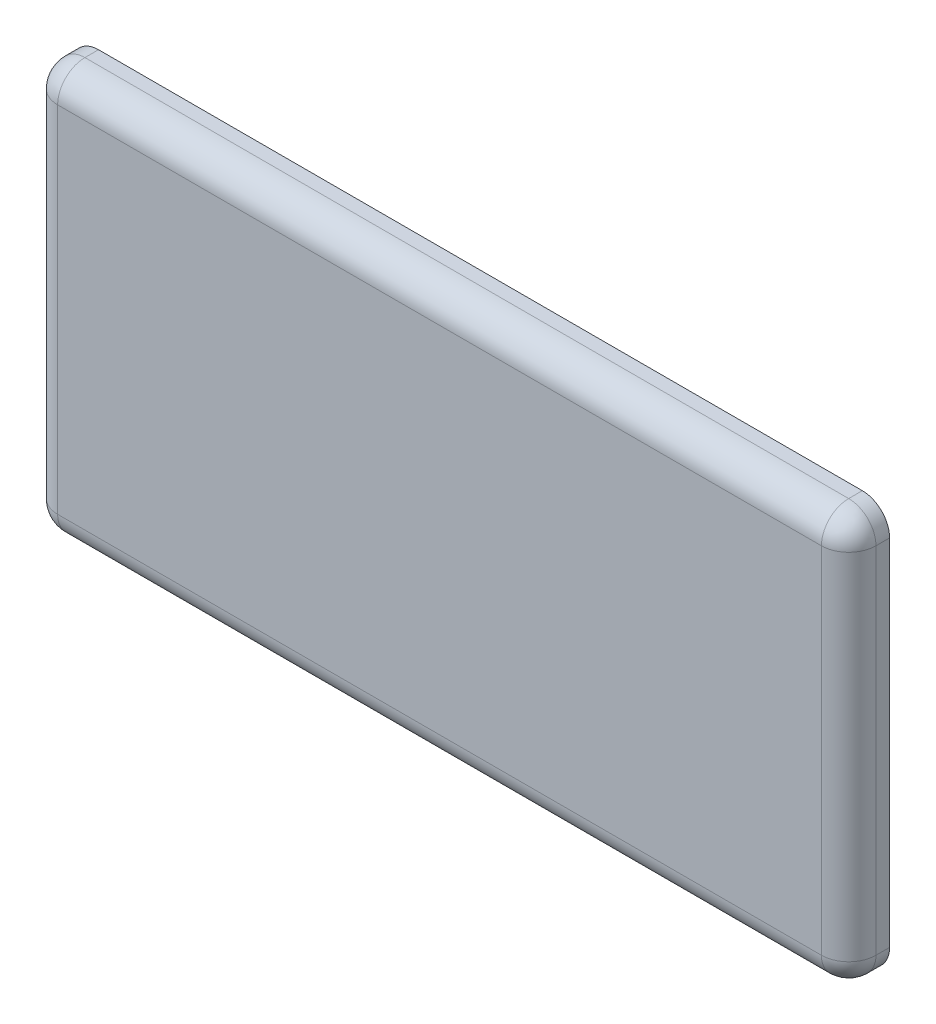
ISO-10303-21;
HEADER;
FILE_DESCRIPTION(('STEP AP214'),'2;1');
FILE_NAME('part.step','',(''),(''),'','','');
FILE_SCHEMA(('AUTOMOTIVE_DESIGN { 1 0 10303 214 1 1 1 1 }'));
ENDSEC;
DATA;
#1=APPLICATION_CONTEXT('core data for automotive mechanical design processes');
#2=APPLICATION_PROTOCOL_DEFINITION('international standard','automotive_design',2000,#1);
#3=PRODUCT_CONTEXT('',#1,'mechanical');
#4=PRODUCT('Part','Part','',(#3));
#5=PRODUCT_RELATED_PRODUCT_CATEGORY('part','',(#4));
#6=PRODUCT_DEFINITION_FORMATION('','',#4);
#7=PRODUCT_DEFINITION_CONTEXT('part definition',#1,'design');
#8=PRODUCT_DEFINITION('design','',#6,#7);
#9=PRODUCT_DEFINITION_SHAPE('','',#8);
#10=(LENGTH_UNIT() NAMED_UNIT(*) SI_UNIT(.MILLI.,.METRE.));
#11=(NAMED_UNIT(*) PLANE_ANGLE_UNIT() SI_UNIT($,.RADIAN.));
#12=(NAMED_UNIT(*) SI_UNIT($,.STERADIAN.) SOLID_ANGLE_UNIT());
#13=UNCERTAINTY_MEASURE_WITH_UNIT(LENGTH_MEASURE(1.E-05),#10,'distance_accuracy_value','');
#14=(GEOMETRIC_REPRESENTATION_CONTEXT(3) GLOBAL_UNCERTAINTY_ASSIGNED_CONTEXT((#13)) GLOBAL_UNIT_ASSIGNED_CONTEXT((#10,
#11,#12)) REPRESENTATION_CONTEXT('',''));
#15=CARTESIAN_POINT('',(0.,0.,0.));
#16=DIRECTION('',(0.,0.,1.));
#17=DIRECTION('',(1.,0.,0.));
#18=AXIS2_PLACEMENT_3D('',#15,#16,#17);
#19=CARTESIAN_POINT('',(30.,15.,3.));
#20=DIRECTION('',(0.,0.,1.));
#21=DIRECTION('',(1.,0.,0.));
#22=AXIS2_PLACEMENT_3D('',#19,#20,#21);
#23=PLANE('',#22);
#24=DIRECTION('',(1.,0.,0.));
#25=VECTOR('',#24,1.);
#26=CARTESIAN_POINT('',(0.,28.,3.));
#27=LINE('',#26,#25);
#28=CARTESIAN_POINT('',(58.,28.,3.));
#29=VERTEX_POINT('',#28);
#30=CARTESIAN_POINT('',(2.,28.,3.));
#31=VERTEX_POINT('',#30);
#32=EDGE_CURVE('E182',#29,#31,#27,.F.);
#33=ORIENTED_EDGE('',*,*,#32,.T.);
#34=DIRECTION('',(0.,1.,0.));
#35=VECTOR('',#34,1.);
#36=CARTESIAN_POINT('',(2.,0.,3.));
#37=LINE('',#36,#35);
#38=CARTESIAN_POINT('',(2.,2.,3.));
#39=VERTEX_POINT('',#38);
#40=EDGE_CURVE('E177',#31,#39,#37,.F.);
#41=ORIENTED_EDGE('',*,*,#40,.T.);
#42=DIRECTION('',(1.,0.,0.));
#43=VECTOR('',#42,1.);
#44=CARTESIAN_POINT('',(0.,2.,3.));
#45=LINE('',#44,#43);
#46=CARTESIAN_POINT('',(58.,2.,3.));
#47=VERTEX_POINT('',#46);
#48=EDGE_CURVE('E171',#39,#47,#45,.T.);
#49=ORIENTED_EDGE('',*,*,#48,.T.);
#50=DIRECTION('',(0.,1.,0.));
#51=VECTOR('',#50,1.);
#52=CARTESIAN_POINT('',(58.,0.,3.));
#53=LINE('',#52,#51);
#54=EDGE_CURVE('E121',#47,#29,#53,.T.);
#55=ORIENTED_EDGE('',*,*,#54,.T.);
#56=EDGE_LOOP('',(#33,#41,#49,#55));
#57=FACE_BOUND('',#56,.T.);
#58=ADVANCED_FACE('F16',(#57),#23,.T.);
#59=CARTESIAN_POINT('',(58.,2.,1.));
#60=DIRECTION('',(0.,1.,0.));
#61=DIRECTION('',(0.,0.,1.));
#62=AXIS2_PLACEMENT_3D('',#59,#60,#61);
#63=CYLINDRICAL_SURFACE('',#62,2.);
#64=DIRECTION('',(0.,1.,0.));
#65=VECTOR('',#64,1.);
#66=CARTESIAN_POINT('',(60.,15.,1.));
#67=LINE('',#66,#65);
#68=CARTESIAN_POINT('',(60.,2.,1.));
#69=VERTEX_POINT('',#68);
#70=CARTESIAN_POINT('',(60.,28.,1.));
#71=VERTEX_POINT('',#70);
#72=EDGE_CURVE('E123',#69,#71,#67,.T.);
#73=ORIENTED_EDGE('',*,*,#72,.T.);
#74=CARTESIAN_POINT('',(58.,28.,1.));
#75=DIRECTION('',(0.,1.,0.));
#76=DIRECTION('',(0.,0.,1.));
#77=AXIS2_PLACEMENT_3D('',#74,#75,#76);
#78=CIRCLE('',#77,2.);
#79=EDGE_CURVE('E20',#71,#29,#78,.F.);
#80=ORIENTED_EDGE('',*,*,#79,.T.);
#81=ORIENTED_EDGE('',*,*,#54,.F.);
#82=CARTESIAN_POINT('',(58.,2.,1.));
#83=DIRECTION('',(0.,1.,0.));
#84=DIRECTION('',(0.,0.,1.));
#85=AXIS2_PLACEMENT_3D('',#82,#83,#84);
#86=CIRCLE('',#85,2.);
#87=EDGE_CURVE('E126',#47,#69,#86,.T.);
#88=ORIENTED_EDGE('',*,*,#87,.T.);
#89=EDGE_LOOP('',(#73,#80,#81,#88));
#90=FACE_BOUND('',#89,.T.);
#91=ADVANCED_FACE('F124',(#90),#63,.T.);
#92=CARTESIAN_POINT('',(58.,28.,1.));
#93=DIRECTION('',(0.95671349487769,0.288115103977403,0.0410971480641482));
#94=DIRECTION('',(-0.271041494718296,0.830639764340859,0.486388825978388));
#95=AXIS2_PLACEMENT_3D('',#92,#93,#94);
#96=SPHERICAL_SURFACE('',#95,2.);
#97=CARTESIAN_POINT('',(59.9134269897554,28.5762302079548,1.08219429612829));
#98=VERTEX_POINT('',#97);
#99=VERTEX_LOOP('',#98);
#100=FACE_BOUND('',#99,.T.);
#101=ORIENTED_EDGE('',*,*,#79,.F.);
#102=CARTESIAN_POINT('',(58.,28.,1.));
#103=DIRECTION('',(0.,0.,1.));
#104=DIRECTION('',(1.,0.,0.));
#105=AXIS2_PLACEMENT_3D('',#102,#103,#104);
#106=CIRCLE('',#105,2.);
#107=CARTESIAN_POINT('',(58.,30.,1.));
#108=VERTEX_POINT('',#107);
#109=EDGE_CURVE('E115',#71,#108,#106,.T.);
#110=ORIENTED_EDGE('',*,*,#109,.T.);
#111=CARTESIAN_POINT('',(58.,28.,1.));
#112=DIRECTION('',(1.,0.,0.));
#113=DIRECTION('',(0.,0.,-1.));
#114=AXIS2_PLACEMENT_3D('',#111,#112,#113);
#115=CIRCLE('',#114,2.);
#116=EDGE_CURVE('E117',#108,#29,#115,.T.);
#117=ORIENTED_EDGE('',*,*,#116,.T.);
#118=EDGE_LOOP('',(#101,#110,#117));
#119=FACE_BOUND('',#118,.T.);
#120=ADVANCED_FACE('F113',(#100,#119),#96,.T.);
#121=CARTESIAN_POINT('',(2.,28.,1.));
#122=DIRECTION('',(1.,0.,0.));
#123=DIRECTION('',(0.,0.,-1.));
#124=AXIS2_PLACEMENT_3D('',#121,#122,#123);
#125=CYLINDRICAL_SURFACE('',#124,2.);
#126=ORIENTED_EDGE('',*,*,#32,.F.);
#127=ORIENTED_EDGE('',*,*,#116,.F.);
#128=DIRECTION('',(1.,0.,0.));
#129=VECTOR('',#128,1.);
#130=CARTESIAN_POINT('',(30.,30.,1.));
#131=LINE('',#130,#129);
#132=CARTESIAN_POINT('',(2.,30.,1.));
#133=VERTEX_POINT('',#132);
#134=EDGE_CURVE('E163',#108,#133,#131,.F.);
#135=ORIENTED_EDGE('',*,*,#134,.T.);
#136=CARTESIAN_POINT('',(2.,28.,1.));
#137=DIRECTION('',(1.,0.,0.));
#138=DIRECTION('',(0.,0.,-1.));
#139=AXIS2_PLACEMENT_3D('',#136,#137,#138);
#140=CIRCLE('',#139,2.);
#141=EDGE_CURVE('E181',#133,#31,#140,.T.);
#142=ORIENTED_EDGE('',*,*,#141,.T.);
#143=EDGE_LOOP('',(#126,#127,#135,#142));
#144=FACE_BOUND('',#143,.T.);
#145=ADVANCED_FACE('F367',(#144),#125,.T.);
#146=CARTESIAN_POINT('',(2.,28.,1.));
#147=DIRECTION('',(0.95671349487769,0.288115103977403,0.0410971480641482));
#148=DIRECTION('',(-0.25121315168317,0.888839782132974,-0.3832176850293));
#149=AXIS2_PLACEMENT_3D('',#146,#147,#148);
#150=SPHERICAL_SURFACE('',#149,2.);
#151=ORIENTED_EDGE('',*,*,#141,.F.);
#152=CARTESIAN_POINT('',(2.,28.,1.));
#153=DIRECTION('',(0.,0.,1.));
#154=DIRECTION('',(1.,0.,0.));
#155=AXIS2_PLACEMENT_3D('',#152,#153,#154);
#156=CIRCLE('',#155,2.);
#157=CARTESIAN_POINT('',(0.,28.,1.));
#158=VERTEX_POINT('',#157);
#159=EDGE_CURVE('E162',#133,#158,#156,.T.);
#160=ORIENTED_EDGE('',*,*,#159,.T.);
#161=CARTESIAN_POINT('',(2.,28.,1.));
#162=DIRECTION('',(0.,1.,0.));
#163=DIRECTION('',(-1.,0.,0.));
#164=AXIS2_PLACEMENT_3D('',#161,#162,#163);
#165=CIRCLE('',#164,2.);
#166=EDGE_CURVE('E180',#158,#31,#165,.T.);
#167=ORIENTED_EDGE('',*,*,#166,.T.);
#168=EDGE_LOOP('',(#151,#160,#167));
#169=FACE_BOUND('',#168,.T.);
#170=ADVANCED_FACE('F376',(#169),#150,.T.);
#171=CARTESIAN_POINT('',(2.,2.,1.));
#172=DIRECTION('',(0.,1.,0.));
#173=DIRECTION('',(-1.,0.,0.));
#174=AXIS2_PLACEMENT_3D('',#171,#172,#173);
#175=CYLINDRICAL_SURFACE('',#174,2.);
#176=DIRECTION('',(0.,1.,0.));
#177=VECTOR('',#176,1.);
#178=CARTESIAN_POINT('',(0.,15.,1.));
#179=LINE('',#178,#177);
#180=CARTESIAN_POINT('',(0.,2.,1.));
#181=VERTEX_POINT('',#180);
#182=EDGE_CURVE('E157',#158,#181,#179,.F.);
#183=ORIENTED_EDGE('',*,*,#182,.T.);
#184=CARTESIAN_POINT('',(2.,2.,1.));
#185=DIRECTION('',(0.,1.,0.));
#186=DIRECTION('',(-1.,0.,0.));
#187=AXIS2_PLACEMENT_3D('',#184,#185,#186);
#188=CIRCLE('',#187,2.);
#189=EDGE_CURVE('E217',#181,#39,#188,.T.);
#190=ORIENTED_EDGE('',*,*,#189,.T.);
#191=ORIENTED_EDGE('',*,*,#40,.F.);
#192=ORIENTED_EDGE('',*,*,#166,.F.);
#193=EDGE_LOOP('',(#183,#190,#191,#192));
#194=FACE_BOUND('',#193,.T.);
#195=ADVANCED_FACE('F385',(#194),#175,.T.);
#196=CARTESIAN_POINT('',(2.,2.,1.));
#197=DIRECTION('',(0.95671349487769,0.288115103977403,0.0410971480641482));
#198=DIRECTION('',(-0.0828189080175208,0.40489781154298,-0.910603531007041));
#199=AXIS2_PLACEMENT_3D('',#196,#197,#198);
#200=SPHERICAL_SURFACE('',#199,2.);
#201=ORIENTED_EDGE('',*,*,#189,.F.);
#202=CARTESIAN_POINT('',(2.,2.,1.));
#203=DIRECTION('',(0.,0.,1.));
#204=DIRECTION('',(1.,0.,0.));
#205=AXIS2_PLACEMENT_3D('',#202,#203,#204);
#206=CIRCLE('',#205,2.);
#207=CARTESIAN_POINT('',(2.,0.,1.));
#208=VERTEX_POINT('',#207);
#209=EDGE_CURVE('E202',#181,#208,#206,.T.);
#210=ORIENTED_EDGE('',*,*,#209,.T.);
#211=CARTESIAN_POINT('',(2.,2.,1.));
#212=DIRECTION('',(1.,0.,0.));
#213=DIRECTION('',(0.,1.,0.));
#214=AXIS2_PLACEMENT_3D('',#211,#212,#213);
#215=CIRCLE('',#214,2.);
#216=EDGE_CURVE('E176',#208,#39,#215,.F.);
#217=ORIENTED_EDGE('',*,*,#216,.T.);
#218=EDGE_LOOP('',(#201,#210,#217));
#219=FACE_BOUND('',#218,.T.);
#220=ADVANCED_FACE('F273',(#219),#200,.T.);
#221=CARTESIAN_POINT('',(2.,2.,1.));
#222=DIRECTION('',(1.,0.,0.));
#223=DIRECTION('',(0.,1.,0.));
#224=AXIS2_PLACEMENT_3D('',#221,#222,#223);
#225=CYLINDRICAL_SURFACE('',#224,2.);
#226=ORIENTED_EDGE('',*,*,#48,.F.);
#227=ORIENTED_EDGE('',*,*,#216,.F.);
#228=DIRECTION('',(1.,0.,0.));
#229=VECTOR('',#228,1.);
#230=CARTESIAN_POINT('',(30.,0.,1.));
#231=LINE('',#230,#229);
#232=CARTESIAN_POINT('',(58.,0.,1.));
#233=VERTEX_POINT('',#232);
#234=EDGE_CURVE('E152',#208,#233,#231,.T.);
#235=ORIENTED_EDGE('',*,*,#234,.T.);
#236=CARTESIAN_POINT('',(58.,2.,1.));
#237=DIRECTION('',(1.,0.,0.));
#238=DIRECTION('',(0.,1.,0.));
#239=AXIS2_PLACEMENT_3D('',#236,#237,#238);
#240=CIRCLE('',#239,2.);
#241=EDGE_CURVE('E175',#233,#47,#240,.F.);
#242=ORIENTED_EDGE('',*,*,#241,.T.);
#243=EDGE_LOOP('',(#226,#227,#235,#242));
#244=FACE_BOUND('',#243,.T.);
#245=ADVANCED_FACE('F277',(#244),#225,.T.);
#246=CARTESIAN_POINT('',(58.,2.,1.));
#247=DIRECTION('',(0.95671349487769,0.288115103977403,0.0410971480641482));
#248=DIRECTION('',(-0.159196748833261,0.636299008643476,-0.754837708888639));
#249=AXIS2_PLACEMENT_3D('',#246,#247,#248);
#250=SPHERICAL_SURFACE('',#249,2.);
#251=ORIENTED_EDGE('',*,*,#241,.F.);
#252=CARTESIAN_POINT('',(58.,2.,1.));
#253=DIRECTION('',(0.,0.,1.));
#254=DIRECTION('',(1.,0.,0.));
#255=AXIS2_PLACEMENT_3D('',#252,#253,#254);
#256=CIRCLE('',#255,2.);
#257=EDGE_CURVE('E197',#233,#69,#256,.T.);
#258=ORIENTED_EDGE('',*,*,#257,.T.);
#259=ORIENTED_EDGE('',*,*,#87,.F.);
#260=EDGE_LOOP('',(#251,#258,#259));
#261=FACE_BOUND('',#260,.T.);
#262=ADVANCED_FACE('F280',(#261),#250,.T.);
#263=CARTESIAN_POINT('',(60.,15.,1.5));
#264=DIRECTION('',(-1.,0.,0.));
#265=DIRECTION('',(0.,0.,1.));
#266=AXIS2_PLACEMENT_3D('',#263,#264,#265);
#267=PLANE('',#266);
#268=DIRECTION('',(0.,1.,0.));
#269=VECTOR('',#268,1.);
#270=CARTESIAN_POINT('',(60.,15.,0.));
#271=LINE('',#270,#269);
#272=CARTESIAN_POINT('',(60.,2.,0.));
#273=VERTEX_POINT('',#272);
#274=CARTESIAN_POINT('',(60.,28.,0.));
#275=VERTEX_POINT('',#274);
#276=EDGE_CURVE('E144',#273,#275,#271,.T.);
#277=ORIENTED_EDGE('',*,*,#276,.T.);
#278=DIRECTION('',(0.,0.,1.));
#279=VECTOR('',#278,1.);
#280=CARTESIAN_POINT('',(60.,28.,0.5));
#281=LINE('',#280,#279);
#282=EDGE_CURVE('E132',#275,#71,#281,.T.);
#283=ORIENTED_EDGE('',*,*,#282,.T.);
#284=ORIENTED_EDGE('',*,*,#72,.F.);
#285=DIRECTION('',(0.,0.,1.));
#286=VECTOR('',#285,1.);
#287=CARTESIAN_POINT('',(60.,2.,0.5));
#288=LINE('',#287,#286);
#289=EDGE_CURVE('E201',#69,#273,#288,.F.);
#290=ORIENTED_EDGE('',*,*,#289,.T.);
#291=EDGE_LOOP('',(#277,#283,#284,#290));
#292=FACE_BOUND('',#291,.T.);
#293=ADVANCED_FACE('F143',(#292),#267,.F.);
#294=CARTESIAN_POINT('',(58.,28.,0.));
#295=DIRECTION('',(0.,0.,1.));
#296=DIRECTION('',(1.,0.,0.));
#297=AXIS2_PLACEMENT_3D('',#294,#295,#296);
#298=CYLINDRICAL_SURFACE('',#297,2.);
#299=ORIENTED_EDGE('',*,*,#109,.F.);
#300=ORIENTED_EDGE('',*,*,#282,.F.);
#301=CARTESIAN_POINT('',(58.,28.,0.));
#302=DIRECTION('',(0.,0.,1.));
#303=DIRECTION('',(1.,0.,0.));
#304=AXIS2_PLACEMENT_3D('',#301,#302,#303);
#305=CIRCLE('',#304,2.);
#306=CARTESIAN_POINT('',(58.,30.,0.));
#307=VERTEX_POINT('',#306);
#308=EDGE_CURVE('E195',#275,#307,#305,.T.);
#309=ORIENTED_EDGE('',*,*,#308,.T.);
#310=DIRECTION('',(0.,0.,-1.));
#311=VECTOR('',#310,1.);
#312=CARTESIAN_POINT('',(58.,30.,1.5));
#313=LINE('',#312,#311);
#314=EDGE_CURVE('E139',#307,#108,#313,.F.);
#315=ORIENTED_EDGE('',*,*,#314,.T.);
#316=EDGE_LOOP('',(#299,#300,#309,#315));
#317=FACE_BOUND('',#316,.T.);
#318=ADVANCED_FACE('F136',(#317),#298,.T.);
#319=CARTESIAN_POINT('',(30.,30.,1.5));
#320=DIRECTION('',(0.,-1.,0.));
#321=DIRECTION('',(0.,0.,-1.));
#322=AXIS2_PLACEMENT_3D('',#319,#320,#321);
#323=PLANE('',#322);
#324=ORIENTED_EDGE('',*,*,#134,.F.);
#325=ORIENTED_EDGE('',*,*,#314,.F.);
#326=DIRECTION('',(1.,0.,0.));
#327=VECTOR('',#326,1.);
#328=CARTESIAN_POINT('',(30.,30.,0.));
#329=LINE('',#328,#327);
#330=CARTESIAN_POINT('',(2.,30.,0.));
#331=VERTEX_POINT('',#330);
#332=EDGE_CURVE('E194',#307,#331,#329,.F.);
#333=ORIENTED_EDGE('',*,*,#332,.T.);
#334=DIRECTION('',(0.,0.,1.));
#335=VECTOR('',#334,1.);
#336=CARTESIAN_POINT('',(2.,30.,0.5));
#337=LINE('',#336,#335);
#338=EDGE_CURVE('E167',#331,#133,#337,.T.);
#339=ORIENTED_EDGE('',*,*,#338,.T.);
#340=EDGE_LOOP('',(#324,#325,#333,#339));
#341=FACE_BOUND('',#340,.T.);
#342=ADVANCED_FACE('F305',(#341),#323,.F.);
#343=CARTESIAN_POINT('',(2.,28.,0.));
#344=DIRECTION('',(0.,0.,1.));
#345=DIRECTION('',(1.,0.,0.));
#346=AXIS2_PLACEMENT_3D('',#343,#344,#345);
#347=CYLINDRICAL_SURFACE('',#346,2.);
#348=ORIENTED_EDGE('',*,*,#159,.F.);
#349=ORIENTED_EDGE('',*,*,#338,.F.);
#350=CARTESIAN_POINT('',(2.,28.,0.));
#351=DIRECTION('',(0.,0.,1.));
#352=DIRECTION('',(1.,0.,0.));
#353=AXIS2_PLACEMENT_3D('',#350,#351,#352);
#354=CIRCLE('',#353,2.);
#355=CARTESIAN_POINT('',(0.,28.,0.));
#356=VERTEX_POINT('',#355);
#357=EDGE_CURVE('E190',#331,#356,#354,.T.);
#358=ORIENTED_EDGE('',*,*,#357,.T.);
#359=DIRECTION('',(0.,0.,-1.));
#360=VECTOR('',#359,1.);
#361=CARTESIAN_POINT('',(0.,28.,1.5));
#362=LINE('',#361,#360);
#363=EDGE_CURVE('E161',#356,#158,#362,.F.);
#364=ORIENTED_EDGE('',*,*,#363,.T.);
#365=EDGE_LOOP('',(#348,#349,#358,#364));
#366=FACE_BOUND('',#365,.T.);
#367=ADVANCED_FACE('F259',(#366),#347,.T.);
#368=CARTESIAN_POINT('',(0.,15.,1.5));
#369=DIRECTION('',(1.,0.,0.));
#370=DIRECTION('',(0.,0.,-1.));
#371=AXIS2_PLACEMENT_3D('',#368,#369,#370);
#372=PLANE('',#371);
#373=DIRECTION('',(0.,1.,0.));
#374=VECTOR('',#373,1.);
#375=CARTESIAN_POINT('',(0.,15.,0.));
#376=LINE('',#375,#374);
#377=CARTESIAN_POINT('',(0.,2.,0.));
#378=VERTEX_POINT('',#377);
#379=EDGE_CURVE('E189',#356,#378,#376,.F.);
#380=ORIENTED_EDGE('',*,*,#379,.T.);
#381=DIRECTION('',(0.,0.,1.));
#382=VECTOR('',#381,1.);
#383=CARTESIAN_POINT('',(0.,2.,0.5));
#384=LINE('',#383,#382);
#385=EDGE_CURVE('E206',#378,#181,#384,.T.);
#386=ORIENTED_EDGE('',*,*,#385,.T.);
#387=ORIENTED_EDGE('',*,*,#182,.F.);
#388=ORIENTED_EDGE('',*,*,#363,.F.);
#389=EDGE_LOOP('',(#380,#386,#387,#388));
#390=FACE_BOUND('',#389,.T.);
#391=ADVANCED_FACE('F264',(#390),#372,.F.);
#392=CARTESIAN_POINT('',(2.,2.,0.));
#393=DIRECTION('',(0.,0.,1.));
#394=DIRECTION('',(1.,0.,0.));
#395=AXIS2_PLACEMENT_3D('',#392,#393,#394);
#396=CYLINDRICAL_SURFACE('',#395,2.);
#397=ORIENTED_EDGE('',*,*,#209,.F.);
#398=ORIENTED_EDGE('',*,*,#385,.F.);
#399=CARTESIAN_POINT('',(2.,2.,0.));
#400=DIRECTION('',(0.,0.,1.));
#401=DIRECTION('',(1.,0.,0.));
#402=AXIS2_PLACEMENT_3D('',#399,#400,#401);
#403=CIRCLE('',#402,2.);
#404=CARTESIAN_POINT('',(2.,0.,0.));
#405=VERTEX_POINT('',#404);
#406=EDGE_CURVE('E185',#378,#405,#403,.T.);
#407=ORIENTED_EDGE('',*,*,#406,.T.);
#408=DIRECTION('',(0.,0.,1.));
#409=VECTOR('',#408,1.);
#410=CARTESIAN_POINT('',(2.,0.,1.5));
#411=LINE('',#410,#409);
#412=EDGE_CURVE('E156',#405,#208,#411,.T.);
#413=ORIENTED_EDGE('',*,*,#412,.T.);
#414=EDGE_LOOP('',(#397,#398,#407,#413));
#415=FACE_BOUND('',#414,.T.);
#416=ADVANCED_FACE('F270',(#415),#396,.T.);
#417=CARTESIAN_POINT('',(30.,0.,1.5));
#418=DIRECTION('',(0.,1.,0.));
#419=DIRECTION('',(0.,0.,1.));
#420=AXIS2_PLACEMENT_3D('',#417,#418,#419);
#421=PLANE('',#420);
#422=ORIENTED_EDGE('',*,*,#234,.F.);
#423=ORIENTED_EDGE('',*,*,#412,.F.);
#424=DIRECTION('',(1.,0.,0.));
#425=VECTOR('',#424,1.);
#426=CARTESIAN_POINT('',(30.,0.,0.));
#427=LINE('',#426,#425);
#428=CARTESIAN_POINT('',(58.,0.,0.));
#429=VERTEX_POINT('',#428);
#430=EDGE_CURVE('E27',#405,#429,#427,.T.);
#431=ORIENTED_EDGE('',*,*,#430,.T.);
#432=DIRECTION('',(0.,0.,1.));
#433=VECTOR('',#432,1.);
#434=CARTESIAN_POINT('',(58.,0.,0.5));
#435=LINE('',#434,#433);
#436=EDGE_CURVE('E39',#429,#233,#435,.T.);
#437=ORIENTED_EDGE('',*,*,#436,.T.);
#438=EDGE_LOOP('',(#422,#423,#431,#437));
#439=FACE_BOUND('',#438,.T.);
#440=ADVANCED_FACE('F274',(#439),#421,.F.);
#441=CARTESIAN_POINT('',(58.,2.,0.));
#442=DIRECTION('',(0.,0.,1.));
#443=DIRECTION('',(1.,0.,0.));
#444=AXIS2_PLACEMENT_3D('',#441,#442,#443);
#445=CYLINDRICAL_SURFACE('',#444,2.);
#446=ORIENTED_EDGE('',*,*,#257,.F.);
#447=ORIENTED_EDGE('',*,*,#436,.F.);
#448=CARTESIAN_POINT('',(58.,2.,0.));
#449=DIRECTION('',(0.,0.,1.));
#450=DIRECTION('',(1.,0.,0.));
#451=AXIS2_PLACEMENT_3D('',#448,#449,#450);
#452=CIRCLE('',#451,2.);
#453=EDGE_CURVE('E11',#429,#273,#452,.T.);
#454=ORIENTED_EDGE('',*,*,#453,.T.);
#455=ORIENTED_EDGE('',*,*,#289,.F.);
#456=EDGE_LOOP('',(#446,#447,#454,#455));
#457=FACE_BOUND('',#456,.T.);
#458=ADVANCED_FACE('F278',(#457),#445,.T.);
#459=CARTESIAN_POINT('',(30.,15.,0.));
#460=DIRECTION('',(0.,0.,1.));
#461=DIRECTION('',(1.,0.,0.));
#462=AXIS2_PLACEMENT_3D('',#459,#460,#461);
#463=PLANE('',#462);
#464=ORIENTED_EDGE('',*,*,#430,.F.);
#465=ORIENTED_EDGE('',*,*,#406,.F.);
#466=ORIENTED_EDGE('',*,*,#379,.F.);
#467=ORIENTED_EDGE('',*,*,#357,.F.);
#468=ORIENTED_EDGE('',*,*,#332,.F.);
#469=ORIENTED_EDGE('',*,*,#308,.F.);
#470=ORIENTED_EDGE('',*,*,#276,.F.);
#471=ORIENTED_EDGE('',*,*,#453,.F.);
#472=EDGE_LOOP('',(#464,#465,#466,#467,#468,#469,#470,#471));
#473=FACE_BOUND('',#472,.T.);
#474=ADVANCED_FACE('F18',(#473),#463,.F.);
#475=CLOSED_SHELL('',(#58,#91,#120,#145,#170,#195,#220,#245,#262,#293,#318,#342,#367,#391,#416,
#440,#458,#474));
#476=MANIFOLD_SOLID_BREP('B1',#475);
#477=ADVANCED_BREP_SHAPE_REPRESENTATION('',(#18,#476),#14);
#478=SHAPE_DEFINITION_REPRESENTATION(#9,#477);
ENDSEC;
END-ISO-10303-21;
